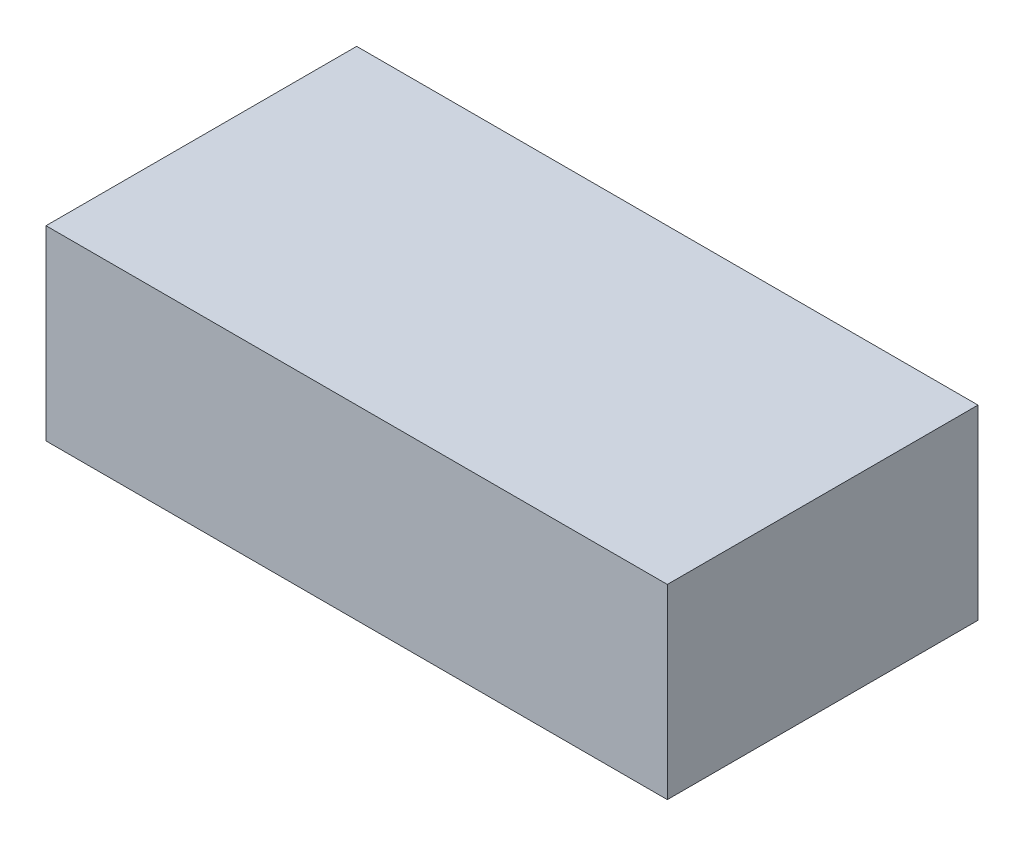
ISO-10303-21;
HEADER;
FILE_DESCRIPTION(('STEP AP214'),'2;1');
FILE_NAME('part.step','',(''),(''),'','','');
FILE_SCHEMA(('AUTOMOTIVE_DESIGN { 1 0 10303 214 1 1 1 1 }'));
ENDSEC;
DATA;
#1=APPLICATION_CONTEXT('core data for automotive mechanical design processes');
#2=APPLICATION_PROTOCOL_DEFINITION('international standard','automotive_design',2000,#1);
#3=PRODUCT_CONTEXT('',#1,'mechanical');
#4=PRODUCT('Part','Part','',(#3));
#5=PRODUCT_RELATED_PRODUCT_CATEGORY('part','',(#4));
#6=PRODUCT_DEFINITION_FORMATION('','',#4);
#7=PRODUCT_DEFINITION_CONTEXT('part definition',#1,'design');
#8=PRODUCT_DEFINITION('design','',#6,#7);
#9=PRODUCT_DEFINITION_SHAPE('','',#8);
#10=(LENGTH_UNIT() NAMED_UNIT(*) SI_UNIT(.MILLI.,.METRE.));
#11=(NAMED_UNIT(*) PLANE_ANGLE_UNIT() SI_UNIT($,.RADIAN.));
#12=(NAMED_UNIT(*) SI_UNIT($,.STERADIAN.) SOLID_ANGLE_UNIT());
#13=UNCERTAINTY_MEASURE_WITH_UNIT(LENGTH_MEASURE(1.E-05),#10,'distance_accuracy_value','');
#14=(GEOMETRIC_REPRESENTATION_CONTEXT(3) GLOBAL_UNCERTAINTY_ASSIGNED_CONTEXT((#13)) GLOBAL_UNIT_ASSIGNED_CONTEXT((#10,
#11,#12)) REPRESENTATION_CONTEXT('',''));
#15=CARTESIAN_POINT('',(0.,0.,0.));
#16=DIRECTION('',(0.,0.,1.));
#17=DIRECTION('',(1.,0.,0.));
#18=AXIS2_PLACEMENT_3D('',#15,#16,#17);
#19=CARTESIAN_POINT('',(0.,30.,0.));
#20=DIRECTION('',(1.,0.,0.));
#21=DIRECTION('',(0.,0.,-1.));
#22=AXIS2_PLACEMENT_3D('',#19,#20,#21);
#23=PLANE('',#22);
#24=DIRECTION('',(0.,0.,1.));
#25=VECTOR('',#24,1.);
#26=CARTESIAN_POINT('',(0.,0.,0.));
#27=LINE('',#26,#25);
#28=CARTESIAN_POINT('',(0.,0.,-50.));
#29=VERTEX_POINT('',#28);
#30=CARTESIAN_POINT('',(0.,0.,0.));
#31=VERTEX_POINT('',#30);
#32=EDGE_CURVE('E96',#29,#31,#27,.T.);
#33=ORIENTED_EDGE('',*,*,#32,.T.);
#34=DIRECTION('',(0.,-1.,0.));
#35=VECTOR('',#34,1.);
#36=CARTESIAN_POINT('',(0.,30.,0.));
#37=LINE('',#36,#35);
#38=CARTESIAN_POINT('',(0.,30.,0.));
#39=VERTEX_POINT('',#38);
#40=EDGE_CURVE('E11',#39,#31,#37,.T.);
#41=ORIENTED_EDGE('',*,*,#40,.F.);
#42=DIRECTION('',(0.,0.,1.));
#43=VECTOR('',#42,1.);
#44=CARTESIAN_POINT('',(0.,30.,0.));
#45=LINE('',#44,#43);
#46=CARTESIAN_POINT('',(0.,30.,-50.));
#47=VERTEX_POINT('',#46);
#48=EDGE_CURVE('E84',#47,#39,#45,.T.);
#49=ORIENTED_EDGE('',*,*,#48,.F.);
#50=DIRECTION('',(0.,-1.,0.));
#51=VECTOR('',#50,1.);
#52=CARTESIAN_POINT('',(0.,30.,-50.));
#53=LINE('',#52,#51);
#54=EDGE_CURVE('E92',#47,#29,#53,.T.);
#55=ORIENTED_EDGE('',*,*,#54,.T.);
#56=EDGE_LOOP('',(#33,#41,#49,#55));
#57=FACE_BOUND('',#56,.T.);
#58=ADVANCED_FACE('F33',(#57),#23,.F.);
#59=CARTESIAN_POINT('',(0.,30.,0.));
#60=DIRECTION('',(0.,0.,-1.));
#61=DIRECTION('',(-1.,0.,0.));
#62=AXIS2_PLACEMENT_3D('',#59,#60,#61);
#63=PLANE('',#62);
#64=DIRECTION('',(1.,0.,0.));
#65=VECTOR('',#64,1.);
#66=CARTESIAN_POINT('',(0.,0.,0.));
#67=LINE('',#66,#65);
#68=CARTESIAN_POINT('',(100.,0.,0.));
#69=VERTEX_POINT('',#68);
#70=EDGE_CURVE('E88',#31,#69,#67,.T.);
#71=ORIENTED_EDGE('',*,*,#70,.T.);
#72=DIRECTION('',(0.,-1.,0.));
#73=VECTOR('',#72,1.);
#74=CARTESIAN_POINT('',(100.,30.,0.));
#75=LINE('',#74,#73);
#76=CARTESIAN_POINT('',(100.,30.,0.));
#77=VERTEX_POINT('',#76);
#78=EDGE_CURVE('E41',#77,#69,#75,.T.);
#79=ORIENTED_EDGE('',*,*,#78,.F.);
#80=DIRECTION('',(1.,0.,0.));
#81=VECTOR('',#80,1.);
#82=CARTESIAN_POINT('',(0.,30.,0.));
#83=LINE('',#82,#81);
#84=EDGE_CURVE('E79',#39,#77,#83,.T.);
#85=ORIENTED_EDGE('',*,*,#84,.F.);
#86=ORIENTED_EDGE('',*,*,#40,.T.);
#87=EDGE_LOOP('',(#71,#79,#85,#86));
#88=FACE_BOUND('',#87,.T.);
#89=ADVANCED_FACE('F87',(#88),#63,.F.);
#90=CARTESIAN_POINT('',(100.,30.,0.));
#91=DIRECTION('',(-1.,0.,0.));
#92=DIRECTION('',(0.,0.,1.));
#93=AXIS2_PLACEMENT_3D('',#90,#91,#92);
#94=PLANE('',#93);
#95=DIRECTION('',(0.,0.,-1.));
#96=VECTOR('',#95,1.);
#97=CARTESIAN_POINT('',(100.,0.,0.));
#98=LINE('',#97,#96);
#99=CARTESIAN_POINT('',(100.,0.,-50.));
#100=VERTEX_POINT('',#99);
#101=EDGE_CURVE('E66',#69,#100,#98,.T.);
#102=ORIENTED_EDGE('',*,*,#101,.T.);
#103=DIRECTION('',(0.,-1.,0.));
#104=VECTOR('',#103,1.);
#105=CARTESIAN_POINT('',(100.,30.,-50.));
#106=LINE('',#105,#104);
#107=CARTESIAN_POINT('',(100.,30.,-50.));
#108=VERTEX_POINT('',#107);
#109=EDGE_CURVE('E89',#108,#100,#106,.T.);
#110=ORIENTED_EDGE('',*,*,#109,.F.);
#111=DIRECTION('',(0.,0.,-1.));
#112=VECTOR('',#111,1.);
#113=CARTESIAN_POINT('',(100.,30.,0.));
#114=LINE('',#113,#112);
#115=EDGE_CURVE('E82',#77,#108,#114,.T.);
#116=ORIENTED_EDGE('',*,*,#115,.F.);
#117=ORIENTED_EDGE('',*,*,#78,.T.);
#118=EDGE_LOOP('',(#102,#110,#116,#117));
#119=FACE_BOUND('',#118,.T.);
#120=ADVANCED_FACE('F90',(#119),#94,.F.);
#121=CARTESIAN_POINT('',(0.,30.,-50.));
#122=DIRECTION('',(0.,0.,1.));
#123=DIRECTION('',(1.,0.,0.));
#124=AXIS2_PLACEMENT_3D('',#121,#122,#123);
#125=PLANE('',#124);
#126=DIRECTION('',(-1.,0.,0.));
#127=VECTOR('',#126,1.);
#128=CARTESIAN_POINT('',(0.,0.,-50.));
#129=LINE('',#128,#127);
#130=EDGE_CURVE('E72',#100,#29,#129,.T.);
#131=ORIENTED_EDGE('',*,*,#130,.T.);
#132=ORIENTED_EDGE('',*,*,#54,.F.);
#133=DIRECTION('',(-1.,0.,0.));
#134=VECTOR('',#133,1.);
#135=CARTESIAN_POINT('',(0.,30.,-50.));
#136=LINE('',#135,#134);
#137=EDGE_CURVE('E49',#108,#47,#136,.T.);
#138=ORIENTED_EDGE('',*,*,#137,.F.);
#139=ORIENTED_EDGE('',*,*,#109,.T.);
#140=EDGE_LOOP('',(#131,#132,#138,#139));
#141=FACE_BOUND('',#140,.T.);
#142=ADVANCED_FACE('F103',(#141),#125,.F.);
#143=CARTESIAN_POINT('',(0.,30.,0.));
#144=DIRECTION('',(0.,-1.,0.));
#145=DIRECTION('',(0.,0.,-1.));
#146=AXIS2_PLACEMENT_3D('',#143,#144,#145);
#147=PLANE('',#146);
#148=ORIENTED_EDGE('',*,*,#48,.T.);
#149=ORIENTED_EDGE('',*,*,#84,.T.);
#150=ORIENTED_EDGE('',*,*,#115,.T.);
#151=ORIENTED_EDGE('',*,*,#137,.T.);
#152=EDGE_LOOP('',(#148,#149,#150,#151));
#153=FACE_BOUND('',#152,.T.);
#154=ADVANCED_FACE('F80',(#153),#147,.F.);
#155=CARTESIAN_POINT('',(0.,0.,0.));
#156=DIRECTION('',(0.,-1.,0.));
#157=DIRECTION('',(0.,0.,-1.));
#158=AXIS2_PLACEMENT_3D('',#155,#156,#157);
#159=PLANE('',#158);
#160=ORIENTED_EDGE('',*,*,#32,.F.);
#161=ORIENTED_EDGE('',*,*,#130,.F.);
#162=ORIENTED_EDGE('',*,*,#101,.F.);
#163=ORIENTED_EDGE('',*,*,#70,.F.);
#164=EDGE_LOOP('',(#160,#161,#162,#163));
#165=FACE_BOUND('',#164,.T.);
#166=ADVANCED_FACE('F106',(#165),#159,.T.);
#167=CLOSED_SHELL('',(#58,#89,#120,#142,#154,#166));
#168=MANIFOLD_SOLID_BREP('B2',#167);
#169=ADVANCED_BREP_SHAPE_REPRESENTATION('',(#18,#168),#14);
#170=SHAPE_DEFINITION_REPRESENTATION(#9,#169);
ENDSEC;
END-ISO-10303-21;
